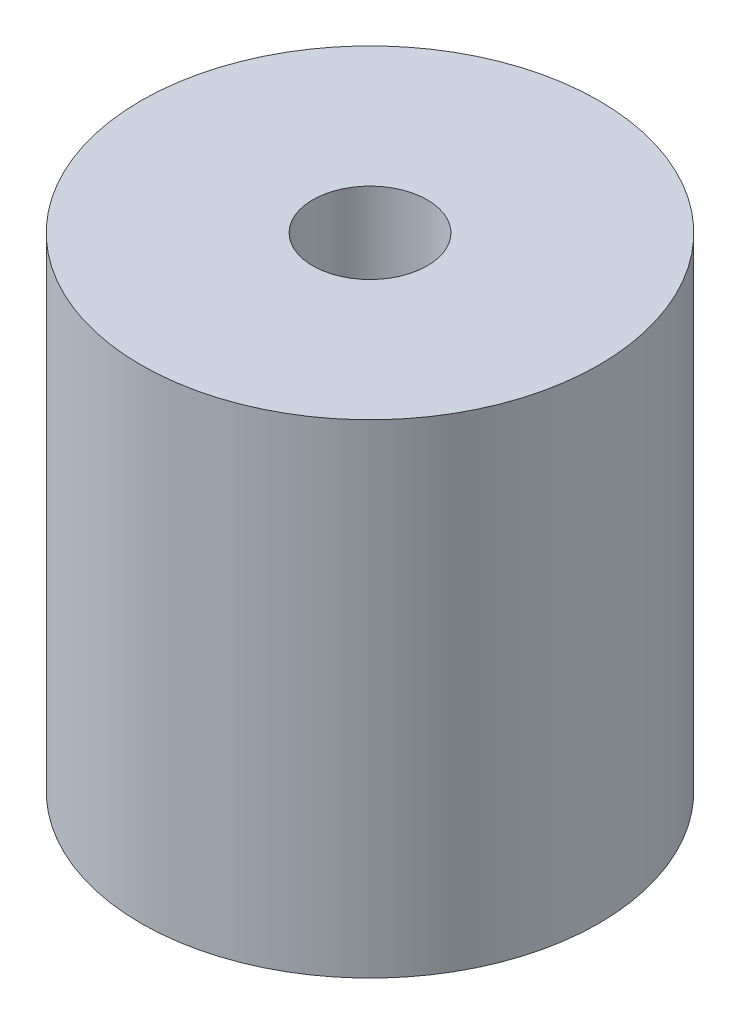
ISO-10303-21;
HEADER;
FILE_DESCRIPTION(('STEP AP214'),'2;1');
FILE_NAME('part.step','',(''),(''),'','','');
FILE_SCHEMA(('AUTOMOTIVE_DESIGN { 1 0 10303 214 1 1 1 1 }'));
ENDSEC;
DATA;
#1=APPLICATION_CONTEXT('core data for automotive mechanical design processes');
#2=APPLICATION_PROTOCOL_DEFINITION('international standard','automotive_design',2000,#1);
#3=PRODUCT_CONTEXT('',#1,'mechanical');
#4=PRODUCT('Part','Part','',(#3));
#5=PRODUCT_RELATED_PRODUCT_CATEGORY('part','',(#4));
#6=PRODUCT_DEFINITION_FORMATION('','',#4);
#7=PRODUCT_DEFINITION_CONTEXT('part definition',#1,'design');
#8=PRODUCT_DEFINITION('design','',#6,#7);
#9=PRODUCT_DEFINITION_SHAPE('','',#8);
#10=(LENGTH_UNIT() NAMED_UNIT(*) SI_UNIT(.MILLI.,.METRE.));
#11=(NAMED_UNIT(*) PLANE_ANGLE_UNIT() SI_UNIT($,.RADIAN.));
#12=(NAMED_UNIT(*) SI_UNIT($,.STERADIAN.) SOLID_ANGLE_UNIT());
#13=UNCERTAINTY_MEASURE_WITH_UNIT(LENGTH_MEASURE(1.E-05),#10,'distance_accuracy_value','');
#14=(GEOMETRIC_REPRESENTATION_CONTEXT(3) GLOBAL_UNCERTAINTY_ASSIGNED_CONTEXT((#13)) GLOBAL_UNIT_ASSIGNED_CONTEXT((#10,
#11,#12)) REPRESENTATION_CONTEXT('',''));
#15=CARTESIAN_POINT('',(0.,0.,0.));
#16=DIRECTION('',(0.,0.,1.));
#17=DIRECTION('',(1.,0.,0.));
#18=AXIS2_PLACEMENT_3D('',#15,#16,#17);
#19=CARTESIAN_POINT('',(0.,13.41,0.));
#20=DIRECTION('',(0.,1.,0.));
#21=DIRECTION('',(0.,0.,1.));
#22=AXIS2_PLACEMENT_3D('',#19,#20,#21);
#23=PLANE('',#22);
#24=CARTESIAN_POINT('',(0.,13.41,0.));
#25=DIRECTION('',(0.,1.,0.));
#26=DIRECTION('',(0.,0.,1.));
#27=AXIS2_PLACEMENT_3D('',#24,#25,#26);
#28=CIRCLE('',#27,6.35);
#29=CARTESIAN_POINT('',(0.,13.41,-6.35));
#30=VERTEX_POINT('',#29);
#31=EDGE_CURVE('E10',#30,#30,#28,.T.);
#32=ORIENTED_EDGE('',*,*,#31,.T.);
#33=EDGE_LOOP('',(#32));
#34=FACE_BOUND('',#33,.T.);
#35=CARTESIAN_POINT('',(0.,13.41,0.));
#36=DIRECTION('',(0.,1.,0.));
#37=DIRECTION('',(0.,0.,1.));
#38=AXIS2_PLACEMENT_3D('',#35,#36,#37);
#39=CIRCLE('',#38,1.5875);
#40=CARTESIAN_POINT('',(0.,13.41,-1.5875));
#41=VERTEX_POINT('',#40);
#42=EDGE_CURVE('E50',#41,#41,#39,.T.);
#43=ORIENTED_EDGE('',*,*,#42,.F.);
#44=EDGE_LOOP('',(#43));
#45=FACE_BOUND('',#44,.T.);
#46=ADVANCED_FACE('F37',(#34,#45),#23,.T.);
#47=CARTESIAN_POINT('',(0.,0.,0.));
#48=DIRECTION('',(0.,1.,0.));
#49=DIRECTION('',(0.,0.,1.));
#50=AXIS2_PLACEMENT_3D('',#47,#48,#49);
#51=PLANE('',#50);
#52=CARTESIAN_POINT('',(0.,0.,0.));
#53=DIRECTION('',(0.,1.,0.));
#54=DIRECTION('',(0.,0.,1.));
#55=AXIS2_PLACEMENT_3D('',#52,#53,#54);
#56=CIRCLE('',#55,6.35);
#57=CARTESIAN_POINT('',(0.,0.,-6.35));
#58=VERTEX_POINT('',#57);
#59=EDGE_CURVE('E41',#58,#58,#56,.T.);
#60=ORIENTED_EDGE('',*,*,#59,.F.);
#61=EDGE_LOOP('',(#60));
#62=FACE_BOUND('',#61,.T.);
#63=CARTESIAN_POINT('',(0.,0.,0.));
#64=DIRECTION('',(0.,1.,0.));
#65=DIRECTION('',(0.,0.,1.));
#66=AXIS2_PLACEMENT_3D('',#63,#64,#65);
#67=CIRCLE('',#66,1.5875);
#68=CARTESIAN_POINT('',(0.,0.,-1.5875));
#69=VERTEX_POINT('',#68);
#70=EDGE_CURVE('E52',#69,#69,#67,.T.);
#71=ORIENTED_EDGE('',*,*,#70,.T.);
#72=EDGE_LOOP('',(#71));
#73=FACE_BOUND('',#72,.T.);
#74=ADVANCED_FACE('F64',(#62,#73),#51,.F.);
#75=CARTESIAN_POINT('',(0.,13.41,0.));
#76=DIRECTION('',(0.,-1.,0.));
#77=DIRECTION('',(0.,0.,-1.));
#78=AXIS2_PLACEMENT_3D('',#75,#76,#77);
#79=CYLINDRICAL_SURFACE('',#78,6.35);
#80=CARTESIAN_POINT('',(0.,13.41,-6.35));
#81=CARTESIAN_POINT('',(0.,13.2703125,-6.35));
#82=CARTESIAN_POINT('',(0.,13.130625,-6.35));
#83=CARTESIAN_POINT('',(0.,12.85125,-6.35));
#84=CARTESIAN_POINT('',(0.,12.7115625,-6.35));
#85=CARTESIAN_POINT('',(0.,12.4321875,-6.35));
#86=CARTESIAN_POINT('',(0.,12.2925,-6.35));
#87=CARTESIAN_POINT('',(0.,12.013125,-6.35));
#88=CARTESIAN_POINT('',(0.,11.8734375,-6.35));
#89=CARTESIAN_POINT('',(0.,11.5940625,-6.35));
#90=CARTESIAN_POINT('',(0.,11.454375,-6.35));
#91=CARTESIAN_POINT('',(0.,11.175,-6.35));
#92=CARTESIAN_POINT('',(0.,11.0353125,-6.35));
#93=CARTESIAN_POINT('',(0.,10.7559375,-6.35));
#94=CARTESIAN_POINT('',(0.,10.61625,-6.35));
#95=CARTESIAN_POINT('',(0.,10.336875,-6.35));
#96=CARTESIAN_POINT('',(0.,10.1971875,-6.35));
#97=CARTESIAN_POINT('',(0.,9.9178125,-6.35));
#98=CARTESIAN_POINT('',(0.,9.778125,-6.35));
#99=CARTESIAN_POINT('',(0.,9.49875,-6.35));
#100=CARTESIAN_POINT('',(0.,9.3590625,-6.35));
#101=CARTESIAN_POINT('',(0.,9.0796875,-6.35));
#102=CARTESIAN_POINT('',(0.,8.94,-6.35));
#103=CARTESIAN_POINT('',(0.,8.660625,-6.35));
#104=CARTESIAN_POINT('',(0.,8.5209375,-6.35));
#105=CARTESIAN_POINT('',(0.,8.2415625,-6.35));
#106=CARTESIAN_POINT('',(0.,8.101875,-6.35));
#107=CARTESIAN_POINT('',(0.,7.8225,-6.35));
#108=CARTESIAN_POINT('',(0.,7.6828125,-6.35));
#109=CARTESIAN_POINT('',(0.,7.4034375,-6.35));
#110=CARTESIAN_POINT('',(0.,7.26375,-6.35));
#111=CARTESIAN_POINT('',(0.,6.984375,-6.35));
#112=CARTESIAN_POINT('',(0.,6.8446875,-6.35));
#113=CARTESIAN_POINT('',(0.,6.5653125,-6.35));
#114=CARTESIAN_POINT('',(0.,6.425625,-6.35));
#115=CARTESIAN_POINT('',(0.,6.14625,-6.35));
#116=CARTESIAN_POINT('',(0.,6.0065625,-6.35));
#117=CARTESIAN_POINT('',(0.,5.7271875,-6.35));
#118=CARTESIAN_POINT('',(0.,5.5875,-6.35));
#119=CARTESIAN_POINT('',(0.,5.308125,-6.35));
#120=CARTESIAN_POINT('',(0.,5.1684375,-6.35));
#121=CARTESIAN_POINT('',(0.,4.8890625,-6.35));
#122=CARTESIAN_POINT('',(0.,4.749375,-6.35));
#123=CARTESIAN_POINT('',(0.,4.47,-6.35));
#124=CARTESIAN_POINT('',(0.,4.3303125,-6.35));
#125=CARTESIAN_POINT('',(0.,4.0509375,-6.35));
#126=CARTESIAN_POINT('',(0.,3.91125,-6.35));
#127=CARTESIAN_POINT('',(0.,3.631875,-6.35));
#128=CARTESIAN_POINT('',(0.,3.4921875,-6.35));
#129=CARTESIAN_POINT('',(0.,3.2128125,-6.35));
#130=CARTESIAN_POINT('',(0.,3.073125,-6.35));
#131=CARTESIAN_POINT('',(0.,2.79375,-6.35));
#132=CARTESIAN_POINT('',(0.,2.6540625,-6.35));
#133=CARTESIAN_POINT('',(0.,2.3746875,-6.35));
#134=CARTESIAN_POINT('',(0.,2.235,-6.35));
#135=CARTESIAN_POINT('',(0.,1.955625,-6.35));
#136=CARTESIAN_POINT('',(0.,1.8159375,-6.35));
#137=CARTESIAN_POINT('',(0.,1.5365625,-6.35));
#138=CARTESIAN_POINT('',(0.,1.396875,-6.35));
#139=CARTESIAN_POINT('',(0.,1.1175,-6.35));
#140=CARTESIAN_POINT('',(0.,0.9778125,-6.35));
#141=CARTESIAN_POINT('',(0.,0.6984375,-6.35));
#142=CARTESIAN_POINT('',(0.,0.55875,-6.35));
#143=CARTESIAN_POINT('',(0.,0.279374999999999,-6.35));
#144=CARTESIAN_POINT('',(0.,0.1396875,-6.35));
#145=CARTESIAN_POINT('',(0.,0.,-6.35));
#146=B_SPLINE_CURVE_WITH_KNOTS('',3,(#80,#81,#82,#83,#84,#85,#86,#87,#88,#89,#90,#91,#92,#93,
#94,#95,#96,#97,#98,#99,#100,#101,#102,#103,#104,#105,#106,#107,#108,#109,#110,#111,#112,#113,
#114,#115,#116,#117,#118,#119,#120,#121,#122,#123,#124,#125,#126,#127,#128,#129,#130,#131,#132,
#133,#134,#135,#136,#137,#138,#139,#140,#141,#142,#143,#144,#145),.UNSPECIFIED.,.F.,.F.,(4,2,2,
2,2,2,2,2,2,2,2,2,2,2,2,2,2,2,2,2,2,2,2,2,2,2,2,2,2,2,2,2,4),(0.,0.419062500000001,0.838125,
1.2571875,1.67625,2.0953125,2.514375,2.9334375,3.3525,3.7715625,4.190625,4.6096875,5.02875,
5.4478125,5.866875,6.2859375,6.705,7.1240625,7.543125,7.9621875,8.38125,8.8003125,9.219375,
9.6384375,10.0575,10.4765625,10.895625,11.3146875,11.73375,12.1528125,12.571875,12.9909375,
13.41),.UNSPECIFIED.);
#147=EDGE_CURVE('BSEAM39',#30,#58,#146,.T.);
#148=ORIENTED_EDGE('',*,*,#31,.F.);
#149=ORIENTED_EDGE('',*,*,#59,.T.);
#150=ORIENTED_EDGE('',*,*,#147,.T.);
#151=ORIENTED_EDGE('',*,*,#147,.F.);
#152=EDGE_LOOP('',(#148,#150,#149,#151));
#153=FACE_BOUND('',#152,.T.);
#154=ADVANCED_FACE('F39',(#153),#79,.T.);
#155=CARTESIAN_POINT('',(0.,13.41,0.));
#156=DIRECTION('',(0.,-1.,0.));
#157=DIRECTION('',(0.,0.,-1.));
#158=AXIS2_PLACEMENT_3D('',#155,#156,#157);
#159=CYLINDRICAL_SURFACE('',#158,1.5875);
#160=CARTESIAN_POINT('',(0.,13.41,-1.5875));
#161=CARTESIAN_POINT('',(0.,13.2703125,-1.5875));
#162=CARTESIAN_POINT('',(0.,13.130625,-1.5875));
#163=CARTESIAN_POINT('',(0.,12.85125,-1.5875));
#164=CARTESIAN_POINT('',(0.,12.7115625,-1.5875));
#165=CARTESIAN_POINT('',(0.,12.4321875,-1.5875));
#166=CARTESIAN_POINT('',(0.,12.2925,-1.5875));
#167=CARTESIAN_POINT('',(0.,12.013125,-1.5875));
#168=CARTESIAN_POINT('',(0.,11.8734375,-1.5875));
#169=CARTESIAN_POINT('',(0.,11.5940625,-1.5875));
#170=CARTESIAN_POINT('',(0.,11.454375,-1.5875));
#171=CARTESIAN_POINT('',(0.,11.175,-1.5875));
#172=CARTESIAN_POINT('',(0.,11.0353125,-1.5875));
#173=CARTESIAN_POINT('',(0.,10.7559375,-1.5875));
#174=CARTESIAN_POINT('',(0.,10.61625,-1.5875));
#175=CARTESIAN_POINT('',(0.,10.336875,-1.5875));
#176=CARTESIAN_POINT('',(0.,10.1971875,-1.5875));
#177=CARTESIAN_POINT('',(0.,9.9178125,-1.5875));
#178=CARTESIAN_POINT('',(0.,9.778125,-1.5875));
#179=CARTESIAN_POINT('',(0.,9.49875,-1.5875));
#180=CARTESIAN_POINT('',(0.,9.3590625,-1.5875));
#181=CARTESIAN_POINT('',(0.,9.0796875,-1.5875));
#182=CARTESIAN_POINT('',(0.,8.94,-1.5875));
#183=CARTESIAN_POINT('',(0.,8.660625,-1.5875));
#184=CARTESIAN_POINT('',(0.,8.5209375,-1.5875));
#185=CARTESIAN_POINT('',(0.,8.2415625,-1.5875));
#186=CARTESIAN_POINT('',(0.,8.101875,-1.5875));
#187=CARTESIAN_POINT('',(0.,7.8225,-1.5875));
#188=CARTESIAN_POINT('',(0.,7.6828125,-1.5875));
#189=CARTESIAN_POINT('',(0.,7.4034375,-1.5875));
#190=CARTESIAN_POINT('',(0.,7.26375,-1.5875));
#191=CARTESIAN_POINT('',(0.,6.984375,-1.5875));
#192=CARTESIAN_POINT('',(0.,6.8446875,-1.5875));
#193=CARTESIAN_POINT('',(0.,6.5653125,-1.5875));
#194=CARTESIAN_POINT('',(0.,6.425625,-1.5875));
#195=CARTESIAN_POINT('',(0.,6.14625,-1.5875));
#196=CARTESIAN_POINT('',(0.,6.0065625,-1.5875));
#197=CARTESIAN_POINT('',(0.,5.7271875,-1.5875));
#198=CARTESIAN_POINT('',(0.,5.5875,-1.5875));
#199=CARTESIAN_POINT('',(0.,5.308125,-1.5875));
#200=CARTESIAN_POINT('',(0.,5.1684375,-1.5875));
#201=CARTESIAN_POINT('',(0.,4.8890625,-1.5875));
#202=CARTESIAN_POINT('',(0.,4.749375,-1.5875));
#203=CARTESIAN_POINT('',(0.,4.47,-1.5875));
#204=CARTESIAN_POINT('',(0.,4.3303125,-1.5875));
#205=CARTESIAN_POINT('',(0.,4.0509375,-1.5875));
#206=CARTESIAN_POINT('',(0.,3.91125,-1.5875));
#207=CARTESIAN_POINT('',(0.,3.631875,-1.5875));
#208=CARTESIAN_POINT('',(0.,3.4921875,-1.5875));
#209=CARTESIAN_POINT('',(0.,3.2128125,-1.5875));
#210=CARTESIAN_POINT('',(0.,3.073125,-1.5875));
#211=CARTESIAN_POINT('',(0.,2.79375,-1.5875));
#212=CARTESIAN_POINT('',(0.,2.6540625,-1.5875));
#213=CARTESIAN_POINT('',(0.,2.3746875,-1.5875));
#214=CARTESIAN_POINT('',(0.,2.235,-1.5875));
#215=CARTESIAN_POINT('',(0.,1.955625,-1.5875));
#216=CARTESIAN_POINT('',(0.,1.8159375,-1.5875));
#217=CARTESIAN_POINT('',(0.,1.5365625,-1.5875));
#218=CARTESIAN_POINT('',(0.,1.396875,-1.5875));
#219=CARTESIAN_POINT('',(0.,1.1175,-1.5875));
#220=CARTESIAN_POINT('',(0.,0.9778125,-1.5875));
#221=CARTESIAN_POINT('',(0.,0.6984375,-1.5875));
#222=CARTESIAN_POINT('',(0.,0.55875,-1.5875));
#223=CARTESIAN_POINT('',(0.,0.279374999999999,-1.5875));
#224=CARTESIAN_POINT('',(0.,0.1396875,-1.5875));
#225=CARTESIAN_POINT('',(0.,0.,-1.5875));
#226=B_SPLINE_CURVE_WITH_KNOTS('',3,(#160,#161,#162,#163,#164,#165,#166,#167,#168,#169,#170,
#171,#172,#173,#174,#175,#176,#177,#178,#179,#180,#181,#182,#183,#184,#185,#186,#187,#188,#189,
#190,#191,#192,#193,#194,#195,#196,#197,#198,#199,#200,#201,#202,#203,#204,#205,#206,#207,#208,
#209,#210,#211,#212,#213,#214,#215,#216,#217,#218,#219,#220,#221,#222,#223,#224,#225),
.UNSPECIFIED.,.F.,.F.,(4,2,2,2,2,2,2,2,2,2,2,2,2,2,2,2,2,2,2,2,2,2,2,2,2,2,2,2,2,2,2,2,4),(0.,
0.419062499999999,0.838124999999999,1.2571875,1.67625,2.0953125,2.514375,2.9334375,3.3525,
3.7715625,4.190625,4.6096875,5.02875,5.4478125,5.866875,6.2859375,6.705,7.1240625,7.543125,
7.9621875,8.38125,8.8003125,9.219375,9.6384375,10.0575,10.4765625,10.895625,11.3146875,11.73375,
12.1528125,12.571875,12.9909375,13.41),.UNSPECIFIED.);
#227=EDGE_CURVE('BSEAM60',#41,#69,#226,.T.);
#228=ORIENTED_EDGE('',*,*,#42,.T.);
#229=ORIENTED_EDGE('',*,*,#70,.F.);
#230=ORIENTED_EDGE('',*,*,#227,.T.);
#231=ORIENTED_EDGE('',*,*,#227,.F.);
#232=EDGE_LOOP('',(#228,#230,#229,#231));
#233=FACE_BOUND('',#232,.T.);
#234=ADVANCED_FACE('F60',(#233),#159,.F.);
#235=CLOSED_SHELL('',(#46,#74,#154,#234));
#236=MANIFOLD_SOLID_BREP('B2',#235);
#237=ADVANCED_BREP_SHAPE_REPRESENTATION('',(#18,#236),#14);
#238=SHAPE_DEFINITION_REPRESENTATION(#9,#237);
ENDSEC;
END-ISO-10303-21;
